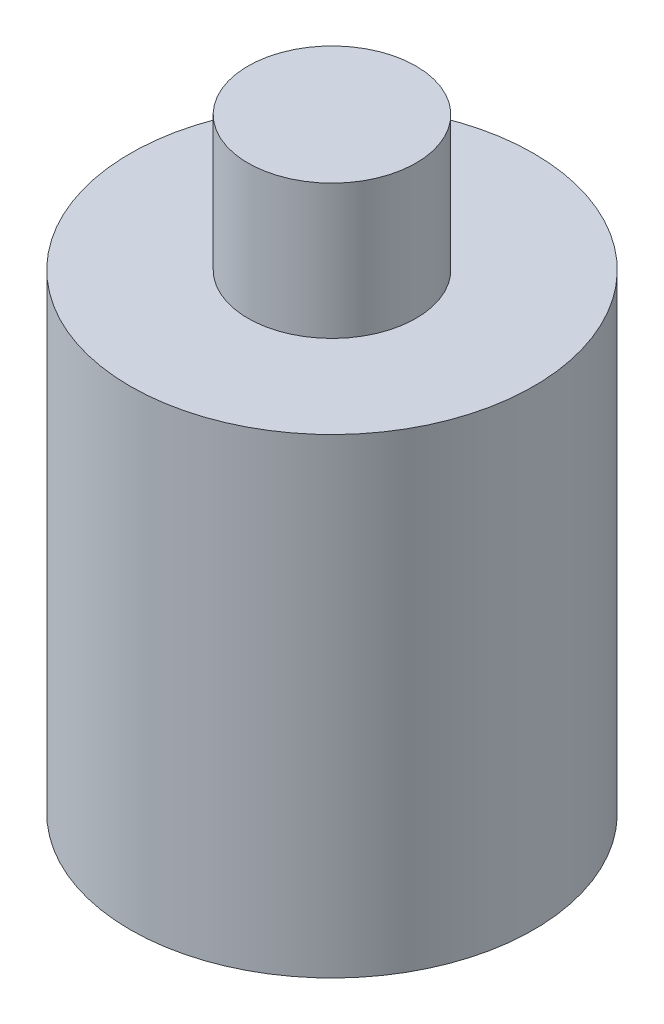
ISO-10303-21;
HEADER;
FILE_DESCRIPTION(('STEP AP214'),'2;1');
FILE_NAME('part.step','',(''),(''),'','','');
FILE_SCHEMA(('AUTOMOTIVE_DESIGN { 1 0 10303 214 1 1 1 1 }'));
ENDSEC;
DATA;
#1=APPLICATION_CONTEXT('core data for automotive mechanical design processes');
#2=APPLICATION_PROTOCOL_DEFINITION('international standard','automotive_design',2000,#1);
#3=PRODUCT_CONTEXT('',#1,'mechanical');
#4=PRODUCT('Part','Part','',(#3));
#5=PRODUCT_RELATED_PRODUCT_CATEGORY('part','',(#4));
#6=PRODUCT_DEFINITION_FORMATION('','',#4);
#7=PRODUCT_DEFINITION_CONTEXT('part definition',#1,'design');
#8=PRODUCT_DEFINITION('design','',#6,#7);
#9=PRODUCT_DEFINITION_SHAPE('','',#8);
#10=(LENGTH_UNIT() NAMED_UNIT(*) SI_UNIT(.MILLI.,.METRE.));
#11=(NAMED_UNIT(*) PLANE_ANGLE_UNIT() SI_UNIT($,.RADIAN.));
#12=(NAMED_UNIT(*) SI_UNIT($,.STERADIAN.) SOLID_ANGLE_UNIT());
#13=UNCERTAINTY_MEASURE_WITH_UNIT(LENGTH_MEASURE(1.E-05),#10,'distance_accuracy_value','');
#14=(GEOMETRIC_REPRESENTATION_CONTEXT(3) GLOBAL_UNCERTAINTY_ASSIGNED_CONTEXT((#13)) GLOBAL_UNIT_ASSIGNED_CONTEXT((#10,
#11,#12)) REPRESENTATION_CONTEXT('',''));
#15=CARTESIAN_POINT('',(0.,0.,0.));
#16=DIRECTION('',(0.,0.,1.));
#17=DIRECTION('',(1.,0.,0.));
#18=AXIS2_PLACEMENT_3D('',#15,#16,#17);
#19=CARTESIAN_POINT('',(0.,0.,0.));
#20=DIRECTION('',(0.,-1.,0.));
#21=DIRECTION('',(0.,0.,-1.));
#22=AXIS2_PLACEMENT_3D('',#19,#20,#21);
#23=CYLINDRICAL_SURFACE('',#22,3.);
#24=CARTESIAN_POINT('',(0.,7.,0.));
#25=DIRECTION('',(0.,-1.,0.));
#26=DIRECTION('',(0.,0.,-1.));
#27=AXIS2_PLACEMENT_3D('',#24,#25,#26);
#28=CIRCLE('',#27,3.);
#29=CARTESIAN_POINT('',(0.,7.,-3.));
#30=VERTEX_POINT('',#29);
#31=EDGE_CURVE('E72',#30,#30,#28,.T.);
#32=ORIENTED_EDGE('',*,*,#31,.T.);
#33=EDGE_LOOP('',(#32));
#34=FACE_BOUND('',#33,.T.);
#35=CARTESIAN_POINT('',(0.,0.,0.));
#36=DIRECTION('',(0.,-1.,0.));
#37=DIRECTION('',(0.,0.,-1.));
#38=AXIS2_PLACEMENT_3D('',#35,#36,#37);
#39=CIRCLE('',#38,3.);
#40=CARTESIAN_POINT('',(0.,0.,-3.));
#41=VERTEX_POINT('',#40);
#42=EDGE_CURVE('E10',#41,#41,#39,.T.);
#43=ORIENTED_EDGE('',*,*,#42,.F.);
#44=EDGE_LOOP('',(#43));
#45=FACE_BOUND('',#44,.T.);
#46=ADVANCED_FACE('F45',(#34,#45),#23,.T.);
#47=CARTESIAN_POINT('',(1.6,0.,0.));
#48=DIRECTION('',(0.,-1.,0.));
#49=DIRECTION('',(0.,0.,-1.));
#50=AXIS2_PLACEMENT_3D('',#47,#48,#49);
#51=PLANE('',#50);
#52=ORIENTED_EDGE('',*,*,#42,.T.);
#53=EDGE_LOOP('',(#52));
#54=FACE_BOUND('',#53,.T.);
#55=CARTESIAN_POINT('',(0.,0.,0.));
#56=DIRECTION('',(0.,-1.,0.));
#57=DIRECTION('',(0.,0.,-1.));
#58=AXIS2_PLACEMENT_3D('',#55,#56,#57);
#59=CIRCLE('',#58,1.6);
#60=CARTESIAN_POINT('',(0.,0.,-1.6));
#61=VERTEX_POINT('',#60);
#62=EDGE_CURVE('E52',#61,#61,#59,.T.);
#63=ORIENTED_EDGE('',*,*,#62,.F.);
#64=EDGE_LOOP('',(#63));
#65=FACE_BOUND('',#64,.T.);
#66=ADVANCED_FACE('F91',(#54,#65),#51,.T.);
#67=CARTESIAN_POINT('',(0.,0.,0.));
#68=DIRECTION('',(0.,-1.,0.));
#69=DIRECTION('',(0.,0.,-1.));
#70=AXIS2_PLACEMENT_3D('',#67,#68,#69);
#71=CYLINDRICAL_SURFACE('',#70,1.6);
#72=ORIENTED_EDGE('',*,*,#62,.T.);
#73=EDGE_LOOP('',(#72));
#74=FACE_BOUND('',#73,.T.);
#75=CARTESIAN_POINT('',(0.,2.7,0.));
#76=DIRECTION('',(0.,-1.,0.));
#77=DIRECTION('',(0.,0.,-1.));
#78=AXIS2_PLACEMENT_3D('',#75,#76,#77);
#79=CIRCLE('',#78,1.6);
#80=CARTESIAN_POINT('',(0.,2.7,-1.6));
#81=VERTEX_POINT('',#80);
#82=EDGE_CURVE('E57',#81,#81,#79,.T.);
#83=ORIENTED_EDGE('',*,*,#82,.F.);
#84=EDGE_LOOP('',(#83));
#85=FACE_BOUND('',#84,.T.);
#86=ADVANCED_FACE('F95',(#74,#85),#71,.F.);
#87=CARTESIAN_POINT('',(1.6,2.7,0.));
#88=DIRECTION('',(0.,-1.,0.));
#89=DIRECTION('',(0.,0.,-1.));
#90=AXIS2_PLACEMENT_3D('',#87,#88,#89);
#91=PLANE('',#90);
#92=ORIENTED_EDGE('',*,*,#82,.T.);
#93=EDGE_LOOP('',(#92));
#94=FACE_BOUND('',#93,.T.);
#95=ADVANCED_FACE('F99',(#94),#91,.T.);
#96=CARTESIAN_POINT('',(0.,9.,0.));
#97=DIRECTION('',(0.,1.,0.));
#98=DIRECTION('',(0.,0.,1.));
#99=AXIS2_PLACEMENT_3D('',#96,#97,#98);
#100=PLANE('',#99);
#101=CARTESIAN_POINT('',(0.,9.,0.));
#102=DIRECTION('',(0.,-1.,0.));
#103=DIRECTION('',(0.,0.,-1.));
#104=AXIS2_PLACEMENT_3D('',#101,#102,#103);
#105=CIRCLE('',#104,1.25);
#106=CARTESIAN_POINT('',(0.,9.,-1.25));
#107=VERTEX_POINT('',#106);
#108=EDGE_CURVE('E62',#107,#107,#105,.T.);
#109=ORIENTED_EDGE('',*,*,#108,.F.);
#110=EDGE_LOOP('',(#109));
#111=FACE_BOUND('',#110,.T.);
#112=ADVANCED_FACE('F87',(#111),#100,.T.);
#113=CARTESIAN_POINT('',(0.,0.,0.));
#114=DIRECTION('',(0.,-1.,0.));
#115=DIRECTION('',(0.,0.,-1.));
#116=AXIS2_PLACEMENT_3D('',#113,#114,#115);
#117=CYLINDRICAL_SURFACE('',#116,1.25);
#118=ORIENTED_EDGE('',*,*,#108,.T.);
#119=EDGE_LOOP('',(#118));
#120=FACE_BOUND('',#119,.T.);
#121=CARTESIAN_POINT('',(0.,7.,0.));
#122=DIRECTION('',(0.,-1.,0.));
#123=DIRECTION('',(0.,0.,-1.));
#124=AXIS2_PLACEMENT_3D('',#121,#122,#123);
#125=CIRCLE('',#124,1.25);
#126=CARTESIAN_POINT('',(0.,7.,-1.25));
#127=VERTEX_POINT('',#126);
#128=EDGE_CURVE('E68',#127,#127,#125,.T.);
#129=ORIENTED_EDGE('',*,*,#128,.F.);
#130=EDGE_LOOP('',(#129));
#131=FACE_BOUND('',#130,.T.);
#132=ADVANCED_FACE('F81',(#120,#131),#117,.T.);
#133=CARTESIAN_POINT('',(1.25,7.,0.));
#134=DIRECTION('',(0.,1.,0.));
#135=DIRECTION('',(0.,0.,1.));
#136=AXIS2_PLACEMENT_3D('',#133,#134,#135);
#137=PLANE('',#136);
#138=ORIENTED_EDGE('',*,*,#128,.T.);
#139=EDGE_LOOP('',(#138));
#140=FACE_BOUND('',#139,.T.);
#141=ORIENTED_EDGE('',*,*,#31,.F.);
#142=EDGE_LOOP('',(#141));
#143=FACE_BOUND('',#142,.T.);
#144=ADVANCED_FACE('F79',(#140,#143),#137,.T.);
#145=CLOSED_SHELL('',(#46,#66,#86,#95,#112,#132,#144));
#146=MANIFOLD_SOLID_BREP('B2',#145);
#147=ADVANCED_BREP_SHAPE_REPRESENTATION('',(#18,#146),#14);
#148=SHAPE_DEFINITION_REPRESENTATION(#9,#147);
ENDSEC;
END-ISO-10303-21;
